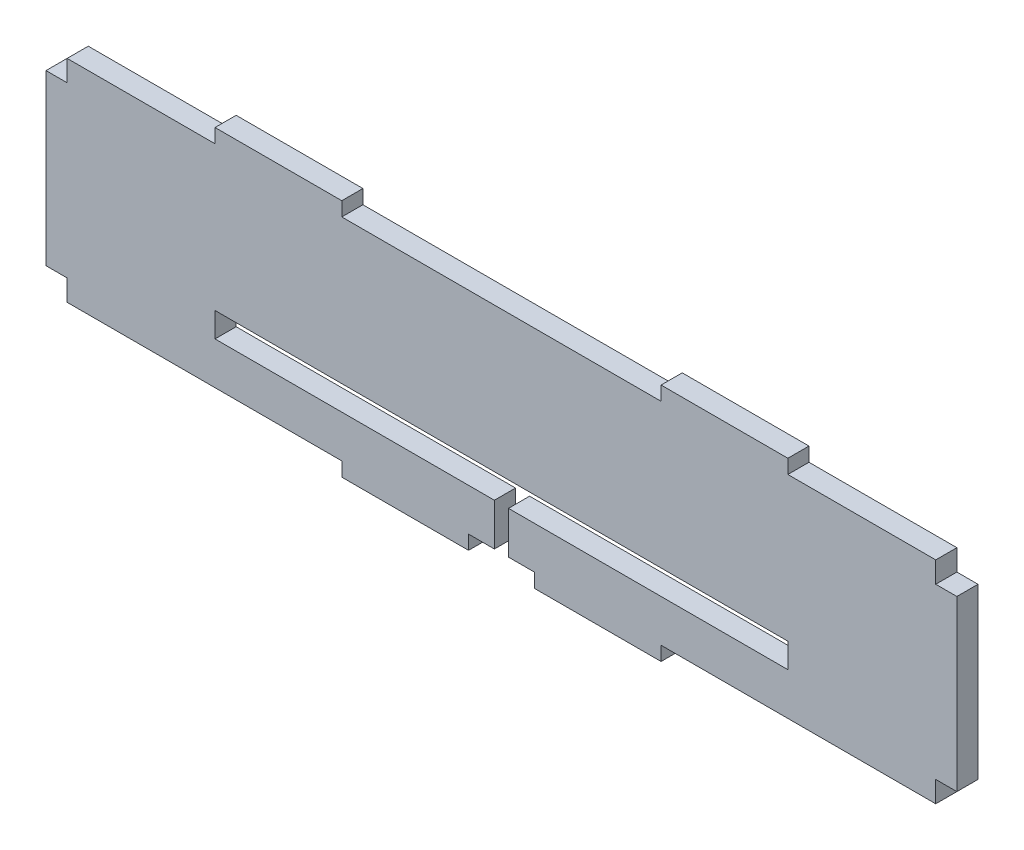
ISO-10303-21;
HEADER;
FILE_DESCRIPTION(('STEP AP214'),'2;1');
FILE_NAME('part.step','',(''),(''),'','','');
FILE_SCHEMA(('AUTOMOTIVE_DESIGN { 1 0 10303 214 1 1 1 1 }'));
ENDSEC;
DATA;
#1=APPLICATION_CONTEXT('core data for automotive mechanical design processes');
#2=APPLICATION_PROTOCOL_DEFINITION('international standard','automotive_design',2000,#1);
#3=PRODUCT_CONTEXT('',#1,'mechanical');
#4=PRODUCT('Part','Part','',(#3));
#5=PRODUCT_RELATED_PRODUCT_CATEGORY('part','',(#4));
#6=PRODUCT_DEFINITION_FORMATION('','',#4);
#7=PRODUCT_DEFINITION_CONTEXT('part definition',#1,'design');
#8=PRODUCT_DEFINITION('design','',#6,#7);
#9=PRODUCT_DEFINITION_SHAPE('','',#8);
#10=(LENGTH_UNIT() NAMED_UNIT(*) SI_UNIT(.MILLI.,.METRE.));
#11=(NAMED_UNIT(*) PLANE_ANGLE_UNIT() SI_UNIT($,.RADIAN.));
#12=(NAMED_UNIT(*) SI_UNIT($,.STERADIAN.) SOLID_ANGLE_UNIT());
#13=UNCERTAINTY_MEASURE_WITH_UNIT(LENGTH_MEASURE(1.E-05),#10,'distance_accuracy_value','');
#14=(GEOMETRIC_REPRESENTATION_CONTEXT(3) GLOBAL_UNCERTAINTY_ASSIGNED_CONTEXT((#13)) GLOBAL_UNIT_ASSIGNED_CONTEXT((#10,
#11,#12)) REPRESENTATION_CONTEXT('',''));
#15=CARTESIAN_POINT('',(0.,0.,0.));
#16=DIRECTION('',(0.,0.,1.));
#17=DIRECTION('',(1.,0.,0.));
#18=AXIS2_PLACEMENT_3D('',#15,#16,#17);
#19=CARTESIAN_POINT('',(0.,30.,3.));
#20=DIRECTION('',(0.,1.,0.));
#21=DIRECTION('',(0.,0.,1.));
#22=AXIS2_PLACEMENT_3D('',#19,#20,#21);
#23=PLANE('',#22);
#24=DIRECTION('',(1.,0.,0.));
#25=VECTOR('',#24,1.);
#26=CARTESIAN_POINT('',(0.,30.,0.));
#27=LINE('',#26,#25);
#28=CARTESIAN_POINT('',(3.,30.,0.));
#29=VERTEX_POINT('',#28);
#30=CARTESIAN_POINT('',(24.,30.,0.));
#31=VERTEX_POINT('',#30);
#32=EDGE_CURVE('E299',#29,#31,#27,.T.);
#33=ORIENTED_EDGE('',*,*,#32,.F.);
#34=DIRECTION('',(0.,0.,-1.));
#35=VECTOR('',#34,1.);
#36=CARTESIAN_POINT('',(3.,30.,3.));
#37=LINE('',#36,#35);
#38=CARTESIAN_POINT('',(3.,30.,3.));
#39=VERTEX_POINT('',#38);
#40=EDGE_CURVE('E11',#39,#29,#37,.T.);
#41=ORIENTED_EDGE('',*,*,#40,.F.);
#42=DIRECTION('',(1.,0.,0.));
#43=VECTOR('',#42,1.);
#44=CARTESIAN_POINT('',(0.,30.,3.));
#45=LINE('',#44,#43);
#46=CARTESIAN_POINT('',(24.,30.,3.));
#47=VERTEX_POINT('',#46);
#48=EDGE_CURVE('E389',#39,#47,#45,.T.);
#49=ORIENTED_EDGE('',*,*,#48,.T.);
#50=DIRECTION('',(0.,0.,-1.));
#51=VECTOR('',#50,1.);
#52=CARTESIAN_POINT('',(24.,30.,3.));
#53=LINE('',#52,#51);
#54=EDGE_CURVE('E53',#47,#31,#53,.T.);
#55=ORIENTED_EDGE('',*,*,#54,.T.);
#56=EDGE_LOOP('',(#33,#41,#49,#55));
#57=FACE_BOUND('',#56,.T.);
#58=ADVANCED_FACE('F37',(#57),#23,.T.);
#59=CARTESIAN_POINT('',(3.,0.,3.));
#60=DIRECTION('',(1.,0.,0.));
#61=DIRECTION('',(0.,0.,-1.));
#62=AXIS2_PLACEMENT_3D('',#59,#60,#61);
#63=PLANE('',#62);
#64=DIRECTION('',(0.,-1.,0.));
#65=VECTOR('',#64,1.);
#66=CARTESIAN_POINT('',(3.,0.,0.));
#67=LINE('',#66,#65);
#68=CARTESIAN_POINT('',(3.,27.,0.));
#69=VERTEX_POINT('',#68);
#70=EDGE_CURVE('E301',#29,#69,#67,.T.);
#71=ORIENTED_EDGE('',*,*,#70,.T.);
#72=DIRECTION('',(0.,0.,-1.));
#73=VECTOR('',#72,1.);
#74=CARTESIAN_POINT('',(3.,27.,3.));
#75=LINE('',#74,#73);
#76=CARTESIAN_POINT('',(3.,27.,3.));
#77=VERTEX_POINT('',#76);
#78=EDGE_CURVE('E45',#77,#69,#75,.T.);
#79=ORIENTED_EDGE('',*,*,#78,.F.);
#80=DIRECTION('',(0.,-1.,0.));
#81=VECTOR('',#80,1.);
#82=CARTESIAN_POINT('',(3.,0.,3.));
#83=LINE('',#82,#81);
#84=EDGE_CURVE('E485',#39,#77,#83,.T.);
#85=ORIENTED_EDGE('',*,*,#84,.F.);
#86=ORIENTED_EDGE('',*,*,#40,.T.);
#87=EDGE_LOOP('',(#71,#79,#85,#86));
#88=FACE_BOUND('',#87,.T.);
#89=ADVANCED_FACE('F474',(#88),#63,.F.);
#90=CARTESIAN_POINT('',(0.,27.,3.));
#91=DIRECTION('',(0.,1.,0.));
#92=DIRECTION('',(0.,0.,1.));
#93=AXIS2_PLACEMENT_3D('',#90,#91,#92);
#94=PLANE('',#93);
#95=DIRECTION('',(1.,0.,0.));
#96=VECTOR('',#95,1.);
#97=CARTESIAN_POINT('',(0.,27.,0.));
#98=LINE('',#97,#96);
#99=CARTESIAN_POINT('',(0.,27.,0.));
#100=VERTEX_POINT('',#99);
#101=EDGE_CURVE('E304',#100,#69,#98,.T.);
#102=ORIENTED_EDGE('',*,*,#101,.F.);
#103=DIRECTION('',(0.,0.,-1.));
#104=VECTOR('',#103,1.);
#105=CARTESIAN_POINT('',(0.,27.,3.));
#106=LINE('',#105,#104);
#107=CARTESIAN_POINT('',(0.,27.,3.));
#108=VERTEX_POINT('',#107);
#109=EDGE_CURVE('E464',#108,#100,#106,.T.);
#110=ORIENTED_EDGE('',*,*,#109,.F.);
#111=DIRECTION('',(1.,0.,0.));
#112=VECTOR('',#111,1.);
#113=CARTESIAN_POINT('',(0.,27.,3.));
#114=LINE('',#113,#112);
#115=EDGE_CURVE('E471',#108,#77,#114,.T.);
#116=ORIENTED_EDGE('',*,*,#115,.T.);
#117=ORIENTED_EDGE('',*,*,#78,.T.);
#118=EDGE_LOOP('',(#102,#110,#116,#117));
#119=FACE_BOUND('',#118,.T.);
#120=ADVANCED_FACE('F469',(#119),#94,.T.);
#121=CARTESIAN_POINT('',(0.,0.,3.));
#122=DIRECTION('',(-1.,0.,0.));
#123=DIRECTION('',(0.,0.,1.));
#124=AXIS2_PLACEMENT_3D('',#121,#122,#123);
#125=PLANE('',#124);
#126=DIRECTION('',(0.,1.,0.));
#127=VECTOR('',#126,1.);
#128=CARTESIAN_POINT('',(0.,0.,0.));
#129=LINE('',#128,#127);
#130=CARTESIAN_POINT('',(0.,3.,0.));
#131=VERTEX_POINT('',#130);
#132=EDGE_CURVE('E307',#131,#100,#129,.T.);
#133=ORIENTED_EDGE('',*,*,#132,.F.);
#134=DIRECTION('',(0.,0.,-1.));
#135=VECTOR('',#134,1.);
#136=CARTESIAN_POINT('',(0.,3.,3.));
#137=LINE('',#136,#135);
#138=CARTESIAN_POINT('',(0.,3.,3.));
#139=VERTEX_POINT('',#138);
#140=EDGE_CURVE('E462',#139,#131,#137,.T.);
#141=ORIENTED_EDGE('',*,*,#140,.F.);
#142=DIRECTION('',(0.,1.,0.));
#143=VECTOR('',#142,1.);
#144=CARTESIAN_POINT('',(0.,0.,3.));
#145=LINE('',#144,#143);
#146=EDGE_CURVE('E484',#139,#108,#145,.T.);
#147=ORIENTED_EDGE('',*,*,#146,.T.);
#148=ORIENTED_EDGE('',*,*,#109,.T.);
#149=EDGE_LOOP('',(#133,#141,#147,#148));
#150=FACE_BOUND('',#149,.T.);
#151=ADVANCED_FACE('F480',(#150),#125,.T.);
#152=CARTESIAN_POINT('',(0.,3.,3.));
#153=DIRECTION('',(0.,1.,0.));
#154=DIRECTION('',(0.,0.,1.));
#155=AXIS2_PLACEMENT_3D('',#152,#153,#154);
#156=PLANE('',#155);
#157=DIRECTION('',(1.,0.,0.));
#158=VECTOR('',#157,1.);
#159=CARTESIAN_POINT('',(0.,3.,0.));
#160=LINE('',#159,#158);
#161=CARTESIAN_POINT('',(3.,3.,0.));
#162=VERTEX_POINT('',#161);
#163=EDGE_CURVE('E310',#131,#162,#160,.T.);
#164=ORIENTED_EDGE('',*,*,#163,.T.);
#165=DIRECTION('',(0.,0.,-1.));
#166=VECTOR('',#165,1.);
#167=CARTESIAN_POINT('',(3.,3.,3.));
#168=LINE('',#167,#166);
#169=CARTESIAN_POINT('',(3.,3.,3.));
#170=VERTEX_POINT('',#169);
#171=EDGE_CURVE('E460',#170,#162,#168,.T.);
#172=ORIENTED_EDGE('',*,*,#171,.F.);
#173=DIRECTION('',(1.,0.,0.));
#174=VECTOR('',#173,1.);
#175=CARTESIAN_POINT('',(0.,3.,3.));
#176=LINE('',#175,#174);
#177=EDGE_CURVE('E487',#139,#170,#176,.T.);
#178=ORIENTED_EDGE('',*,*,#177,.F.);
#179=ORIENTED_EDGE('',*,*,#140,.T.);
#180=EDGE_LOOP('',(#164,#172,#178,#179));
#181=FACE_BOUND('',#180,.T.);
#182=ADVANCED_FACE('F579',(#181),#156,.F.);
#183=CARTESIAN_POINT('',(3.,0.,3.));
#184=DIRECTION('',(-1.,0.,0.));
#185=DIRECTION('',(0.,0.,1.));
#186=AXIS2_PLACEMENT_3D('',#183,#184,#185);
#187=PLANE('',#186);
#188=DIRECTION('',(0.,1.,0.));
#189=VECTOR('',#188,1.);
#190=CARTESIAN_POINT('',(3.,0.,0.));
#191=LINE('',#190,#189);
#192=CARTESIAN_POINT('',(3.,0.,0.));
#193=VERTEX_POINT('',#192);
#194=EDGE_CURVE('E313',#193,#162,#191,.T.);
#195=ORIENTED_EDGE('',*,*,#194,.F.);
#196=DIRECTION('',(0.,0.,-1.));
#197=VECTOR('',#196,1.);
#198=CARTESIAN_POINT('',(3.,0.,3.));
#199=LINE('',#198,#197);
#200=CARTESIAN_POINT('',(3.,0.,3.));
#201=VERTEX_POINT('',#200);
#202=EDGE_CURVE('E458',#201,#193,#199,.T.);
#203=ORIENTED_EDGE('',*,*,#202,.F.);
#204=DIRECTION('',(0.,1.,0.));
#205=VECTOR('',#204,1.);
#206=CARTESIAN_POINT('',(3.,0.,3.));
#207=LINE('',#206,#205);
#208=EDGE_CURVE('E493',#201,#170,#207,.T.);
#209=ORIENTED_EDGE('',*,*,#208,.T.);
#210=ORIENTED_EDGE('',*,*,#171,.T.);
#211=EDGE_LOOP('',(#195,#203,#209,#210));
#212=FACE_BOUND('',#211,.T.);
#213=ADVANCED_FACE('F582',(#212),#187,.T.);
#214=CARTESIAN_POINT('',(0.,0.,3.));
#215=DIRECTION('',(0.,1.,0.));
#216=DIRECTION('',(0.,0.,1.));
#217=AXIS2_PLACEMENT_3D('',#214,#215,#216);
#218=PLANE('',#217);
#219=DIRECTION('',(1.,0.,0.));
#220=VECTOR('',#219,1.);
#221=CARTESIAN_POINT('',(0.,0.,0.));
#222=LINE('',#221,#220);
#223=CARTESIAN_POINT('',(42.,0.,0.));
#224=VERTEX_POINT('',#223);
#225=EDGE_CURVE('E316',#193,#224,#222,.T.);
#226=ORIENTED_EDGE('',*,*,#225,.T.);
#227=DIRECTION('',(0.,0.,-1.));
#228=VECTOR('',#227,1.);
#229=CARTESIAN_POINT('',(42.,0.,3.));
#230=LINE('',#229,#228);
#231=CARTESIAN_POINT('',(42.,0.,3.));
#232=VERTEX_POINT('',#231);
#233=EDGE_CURVE('E455',#232,#224,#230,.T.);
#234=ORIENTED_EDGE('',*,*,#233,.F.);
#235=DIRECTION('',(1.,0.,0.));
#236=VECTOR('',#235,1.);
#237=CARTESIAN_POINT('',(0.,0.,3.));
#238=LINE('',#237,#236);
#239=EDGE_CURVE('E496',#201,#232,#238,.T.);
#240=ORIENTED_EDGE('',*,*,#239,.F.);
#241=ORIENTED_EDGE('',*,*,#202,.T.);
#242=EDGE_LOOP('',(#226,#234,#240,#241));
#243=FACE_BOUND('',#242,.T.);
#244=ADVANCED_FACE('F586',(#243),#218,.F.);
#245=CARTESIAN_POINT('',(42.,2.91433543964104E-13,3.));
#246=DIRECTION('',(1.,0.,0.));
#247=DIRECTION('',(0.,1.,0.));
#248=AXIS2_PLACEMENT_3D('',#245,#246,#247);
#249=PLANE('',#248);
#250=DIRECTION('',(0.,-1.,0.));
#251=VECTOR('',#250,1.);
#252=CARTESIAN_POINT('',(42.,2.91433543964104E-13,0.));
#253=LINE('',#252,#251);
#254=CARTESIAN_POINT('',(42.,-2.,0.));
#255=VERTEX_POINT('',#254);
#256=EDGE_CURVE('E318',#224,#255,#253,.T.);
#257=ORIENTED_EDGE('',*,*,#256,.T.);
#258=DIRECTION('',(0.,0.,-1.));
#259=VECTOR('',#258,1.);
#260=CARTESIAN_POINT('',(42.,-2.,3.));
#261=LINE('',#260,#259);
#262=CARTESIAN_POINT('',(42.,-2.,3.));
#263=VERTEX_POINT('',#262);
#264=EDGE_CURVE('E452',#263,#255,#261,.T.);
#265=ORIENTED_EDGE('',*,*,#264,.F.);
#266=DIRECTION('',(0.,-1.,0.));
#267=VECTOR('',#266,1.);
#268=CARTESIAN_POINT('',(42.,2.91433543964104E-13,3.));
#269=LINE('',#268,#267);
#270=EDGE_CURVE('E498',#232,#263,#269,.T.);
#271=ORIENTED_EDGE('',*,*,#270,.F.);
#272=ORIENTED_EDGE('',*,*,#233,.T.);
#273=EDGE_LOOP('',(#257,#265,#271,#272));
#274=FACE_BOUND('',#273,.T.);
#275=ADVANCED_FACE('F590',(#274),#249,.F.);
#276=CARTESIAN_POINT('',(0.,-2.,3.));
#277=DIRECTION('',(0.,1.,0.));
#278=DIRECTION('',(-1.,0.,0.));
#279=AXIS2_PLACEMENT_3D('',#276,#277,#278);
#280=PLANE('',#279);
#281=DIRECTION('',(1.,0.,0.));
#282=VECTOR('',#281,1.);
#283=CARTESIAN_POINT('',(0.,-2.,0.));
#284=LINE('',#283,#282);
#285=CARTESIAN_POINT('',(60.,-2.,0.));
#286=VERTEX_POINT('',#285);
#287=EDGE_CURVE('E320',#255,#286,#284,.T.);
#288=ORIENTED_EDGE('',*,*,#287,.T.);
#289=DIRECTION('',(0.,0.,-1.));
#290=VECTOR('',#289,1.);
#291=CARTESIAN_POINT('',(60.,-2.,3.));
#292=LINE('',#291,#290);
#293=CARTESIAN_POINT('',(60.,-2.,3.));
#294=VERTEX_POINT('',#293);
#295=EDGE_CURVE('E449',#294,#286,#292,.T.);
#296=ORIENTED_EDGE('',*,*,#295,.F.);
#297=DIRECTION('',(1.,0.,0.));
#298=VECTOR('',#297,1.);
#299=CARTESIAN_POINT('',(0.,-2.,3.));
#300=LINE('',#299,#298);
#301=EDGE_CURVE('E500',#263,#294,#300,.T.);
#302=ORIENTED_EDGE('',*,*,#301,.F.);
#303=ORIENTED_EDGE('',*,*,#264,.T.);
#304=EDGE_LOOP('',(#288,#296,#302,#303));
#305=FACE_BOUND('',#304,.T.);
#306=ADVANCED_FACE('F594',(#305),#280,.F.);
#307=CARTESIAN_POINT('',(60.,4.16333634234434E-13,3.));
#308=DIRECTION('',(-1.,0.,0.));
#309=DIRECTION('',(0.,-1.,0.));
#310=AXIS2_PLACEMENT_3D('',#307,#308,#309);
#311=PLANE('',#310);
#312=DIRECTION('',(0.,1.,0.));
#313=VECTOR('',#312,1.);
#314=CARTESIAN_POINT('',(60.,4.16333634234434E-13,0.));
#315=LINE('',#314,#313);
#316=CARTESIAN_POINT('',(60.,0.,0.));
#317=VERTEX_POINT('',#316);
#318=EDGE_CURVE('E322',#286,#317,#315,.T.);
#319=ORIENTED_EDGE('',*,*,#318,.T.);
#320=DIRECTION('',(0.,0.,-1.));
#321=VECTOR('',#320,1.);
#322=CARTESIAN_POINT('',(60.,0.,3.));
#323=LINE('',#322,#321);
#324=CARTESIAN_POINT('',(60.,0.,3.));
#325=VERTEX_POINT('',#324);
#326=EDGE_CURVE('E446',#325,#317,#323,.T.);
#327=ORIENTED_EDGE('',*,*,#326,.F.);
#328=DIRECTION('',(0.,1.,0.));
#329=VECTOR('',#328,1.);
#330=CARTESIAN_POINT('',(60.,4.16333634234434E-13,3.));
#331=LINE('',#330,#329);
#332=EDGE_CURVE('E502',#294,#325,#331,.T.);
#333=ORIENTED_EDGE('',*,*,#332,.F.);
#334=ORIENTED_EDGE('',*,*,#295,.T.);
#335=EDGE_LOOP('',(#319,#327,#333,#334));
#336=FACE_BOUND('',#335,.T.);
#337=ADVANCED_FACE('F598',(#336),#311,.F.);
#338=CARTESIAN_POINT('',(0.,0.,3.));
#339=DIRECTION('',(0.,1.,0.));
#340=DIRECTION('',(0.,0.,1.));
#341=AXIS2_PLACEMENT_3D('',#338,#339,#340);
#342=PLANE('',#341);
#343=DIRECTION('',(1.,0.,0.));
#344=VECTOR('',#343,1.);
#345=CARTESIAN_POINT('',(0.,0.,0.));
#346=LINE('',#345,#344);
#347=CARTESIAN_POINT('',(63.67,0.,0.));
#348=VERTEX_POINT('',#347);
#349=EDGE_CURVE('E324',#317,#348,#346,.T.);
#350=ORIENTED_EDGE('',*,*,#349,.T.);
#351=DIRECTION('',(0.,0.,-1.));
#352=VECTOR('',#351,1.);
#353=CARTESIAN_POINT('',(63.67,0.,3.));
#354=LINE('',#353,#352);
#355=CARTESIAN_POINT('',(63.67,0.,3.));
#356=VERTEX_POINT('',#355);
#357=EDGE_CURVE('E443',#356,#348,#354,.T.);
#358=ORIENTED_EDGE('',*,*,#357,.F.);
#359=DIRECTION('',(1.,0.,0.));
#360=VECTOR('',#359,1.);
#361=CARTESIAN_POINT('',(0.,0.,3.));
#362=LINE('',#361,#360);
#363=EDGE_CURVE('E504',#325,#356,#362,.T.);
#364=ORIENTED_EDGE('',*,*,#363,.F.);
#365=ORIENTED_EDGE('',*,*,#326,.T.);
#366=EDGE_LOOP('',(#350,#358,#364,#365));
#367=FACE_BOUND('',#366,.T.);
#368=ADVANCED_FACE('F602',(#367),#342,.F.);
#369=CARTESIAN_POINT('',(63.67,0.,3.));
#370=DIRECTION('',(-1.,0.,0.));
#371=DIRECTION('',(0.,0.,1.));
#372=AXIS2_PLACEMENT_3D('',#369,#370,#371);
#373=PLANE('',#372);
#374=DIRECTION('',(0.,1.,0.));
#375=VECTOR('',#374,1.);
#376=CARTESIAN_POINT('',(63.67,0.,0.));
#377=LINE('',#376,#375);
#378=CARTESIAN_POINT('',(63.67,6.,0.));
#379=VERTEX_POINT('',#378);
#380=EDGE_CURVE('E326',#348,#379,#377,.T.);
#381=ORIENTED_EDGE('',*,*,#380,.T.);
#382=DIRECTION('',(0.,0.,-1.));
#383=VECTOR('',#382,1.);
#384=CARTESIAN_POINT('',(63.67,6.,3.));
#385=LINE('',#384,#383);
#386=CARTESIAN_POINT('',(63.67,6.,3.));
#387=VERTEX_POINT('',#386);
#388=EDGE_CURVE('E441',#387,#379,#385,.T.);
#389=ORIENTED_EDGE('',*,*,#388,.F.);
#390=DIRECTION('',(0.,1.,0.));
#391=VECTOR('',#390,1.);
#392=CARTESIAN_POINT('',(63.67,0.,3.));
#393=LINE('',#392,#391);
#394=EDGE_CURVE('E506',#356,#387,#393,.T.);
#395=ORIENTED_EDGE('',*,*,#394,.F.);
#396=ORIENTED_EDGE('',*,*,#357,.T.);
#397=EDGE_LOOP('',(#381,#389,#395,#396));
#398=FACE_BOUND('',#397,.T.);
#399=ADVANCED_FACE('F604',(#398),#373,.F.);
#400=CARTESIAN_POINT('',(0.,6.,3.));
#401=DIRECTION('',(0.,1.,0.));
#402=DIRECTION('',(0.,0.,1.));
#403=AXIS2_PLACEMENT_3D('',#400,#401,#402);
#404=PLANE('',#403);
#405=DIRECTION('',(1.,0.,0.));
#406=VECTOR('',#405,1.);
#407=CARTESIAN_POINT('',(0.,6.,0.));
#408=LINE('',#407,#406);
#409=CARTESIAN_POINT('',(24.,6.,0.));
#410=VERTEX_POINT('',#409);
#411=EDGE_CURVE('E330',#410,#379,#408,.T.);
#412=ORIENTED_EDGE('',*,*,#411,.F.);
#413=DIRECTION('',(0.,0.,-1.));
#414=VECTOR('',#413,1.);
#415=CARTESIAN_POINT('',(24.,6.,3.));
#416=LINE('',#415,#414);
#417=CARTESIAN_POINT('',(24.,6.,3.));
#418=VERTEX_POINT('',#417);
#419=EDGE_CURVE('E439',#418,#410,#416,.T.);
#420=ORIENTED_EDGE('',*,*,#419,.F.);
#421=DIRECTION('',(1.,0.,0.));
#422=VECTOR('',#421,1.);
#423=CARTESIAN_POINT('',(0.,6.,3.));
#424=LINE('',#423,#422);
#425=EDGE_CURVE('E509',#418,#387,#424,.T.);
#426=ORIENTED_EDGE('',*,*,#425,.T.);
#427=ORIENTED_EDGE('',*,*,#388,.T.);
#428=EDGE_LOOP('',(#412,#420,#426,#427));
#429=FACE_BOUND('',#428,.T.);
#430=ADVANCED_FACE('F607',(#429),#404,.T.);
#431=CARTESIAN_POINT('',(24.,0.,3.));
#432=DIRECTION('',(1.,0.,0.));
#433=DIRECTION('',(0.,0.,-1.));
#434=AXIS2_PLACEMENT_3D('',#431,#432,#433);
#435=PLANE('',#434);
#436=DIRECTION('',(0.,-1.,0.));
#437=VECTOR('',#436,1.);
#438=CARTESIAN_POINT('',(24.,0.,0.));
#439=LINE('',#438,#437);
#440=CARTESIAN_POINT('',(24.,9.5,0.));
#441=VERTEX_POINT('',#440);
#442=EDGE_CURVE('E333',#441,#410,#439,.T.);
#443=ORIENTED_EDGE('',*,*,#442,.F.);
#444=DIRECTION('',(0.,0.,-1.));
#445=VECTOR('',#444,1.);
#446=CARTESIAN_POINT('',(24.,9.5,3.));
#447=LINE('',#446,#445);
#448=CARTESIAN_POINT('',(24.,9.5,3.));
#449=VERTEX_POINT('',#448);
#450=EDGE_CURVE('E437',#449,#441,#447,.T.);
#451=ORIENTED_EDGE('',*,*,#450,.F.);
#452=DIRECTION('',(0.,-1.,0.));
#453=VECTOR('',#452,1.);
#454=CARTESIAN_POINT('',(24.,0.,3.));
#455=LINE('',#454,#453);
#456=EDGE_CURVE('E512',#449,#418,#455,.T.);
#457=ORIENTED_EDGE('',*,*,#456,.T.);
#458=ORIENTED_EDGE('',*,*,#419,.T.);
#459=EDGE_LOOP('',(#443,#451,#457,#458));
#460=FACE_BOUND('',#459,.T.);
#461=ADVANCED_FACE('F611',(#460),#435,.T.);
#462=CARTESIAN_POINT('',(0.,9.5,3.));
#463=DIRECTION('',(0.,1.,0.));
#464=DIRECTION('',(0.,0.,1.));
#465=AXIS2_PLACEMENT_3D('',#462,#463,#464);
#466=PLANE('',#465);
#467=DIRECTION('',(1.,0.,0.));
#468=VECTOR('',#467,1.);
#469=CARTESIAN_POINT('',(0.,9.5,0.));
#470=LINE('',#469,#468);
#471=CARTESIAN_POINT('',(105.34,9.5,0.));
#472=VERTEX_POINT('',#471);
#473=EDGE_CURVE('E336',#441,#472,#470,.T.);
#474=ORIENTED_EDGE('',*,*,#473,.T.);
#475=DIRECTION('',(0.,0.,-1.));
#476=VECTOR('',#475,1.);
#477=CARTESIAN_POINT('',(105.34,9.5,3.));
#478=LINE('',#477,#476);
#479=CARTESIAN_POINT('',(105.34,9.5,3.));
#480=VERTEX_POINT('',#479);
#481=EDGE_CURVE('E434',#480,#472,#478,.T.);
#482=ORIENTED_EDGE('',*,*,#481,.F.);
#483=DIRECTION('',(1.,0.,0.));
#484=VECTOR('',#483,1.);
#485=CARTESIAN_POINT('',(0.,9.5,3.));
#486=LINE('',#485,#484);
#487=EDGE_CURVE('E515',#449,#480,#486,.T.);
#488=ORIENTED_EDGE('',*,*,#487,.F.);
#489=ORIENTED_EDGE('',*,*,#450,.T.);
#490=EDGE_LOOP('',(#474,#482,#488,#489));
#491=FACE_BOUND('',#490,.T.);
#492=ADVANCED_FACE('F615',(#491),#466,.F.);
#493=CARTESIAN_POINT('',(105.34,0.,3.));
#494=DIRECTION('',(1.,0.,0.));
#495=DIRECTION('',(0.,0.,-1.));
#496=AXIS2_PLACEMENT_3D('',#493,#494,#495);
#497=PLANE('',#496);
#498=DIRECTION('',(0.,-1.,0.));
#499=VECTOR('',#498,1.);
#500=CARTESIAN_POINT('',(105.34,0.,0.));
#501=LINE('',#500,#499);
#502=CARTESIAN_POINT('',(105.34,6.,0.));
#503=VERTEX_POINT('',#502);
#504=EDGE_CURVE('E338',#472,#503,#501,.T.);
#505=ORIENTED_EDGE('',*,*,#504,.T.);
#506=DIRECTION('',(0.,0.,-1.));
#507=VECTOR('',#506,1.);
#508=CARTESIAN_POINT('',(105.34,6.,3.));
#509=LINE('',#508,#507);
#510=CARTESIAN_POINT('',(105.34,6.,3.));
#511=VERTEX_POINT('',#510);
#512=EDGE_CURVE('E432',#511,#503,#509,.T.);
#513=ORIENTED_EDGE('',*,*,#512,.F.);
#514=DIRECTION('',(0.,-1.,0.));
#515=VECTOR('',#514,1.);
#516=CARTESIAN_POINT('',(105.34,0.,3.));
#517=LINE('',#516,#515);
#518=EDGE_CURVE('E517',#480,#511,#517,.T.);
#519=ORIENTED_EDGE('',*,*,#518,.F.);
#520=ORIENTED_EDGE('',*,*,#481,.T.);
#521=EDGE_LOOP('',(#505,#513,#519,#520));
#522=FACE_BOUND('',#521,.T.);
#523=ADVANCED_FACE('F619',(#522),#497,.F.);
#524=CARTESIAN_POINT('',(0.,6.,3.));
#525=DIRECTION('',(0.,1.,0.));
#526=DIRECTION('',(0.,0.,1.));
#527=AXIS2_PLACEMENT_3D('',#524,#525,#526);
#528=PLANE('',#527);
#529=DIRECTION('',(1.,0.,0.));
#530=VECTOR('',#529,1.);
#531=CARTESIAN_POINT('',(0.,6.,0.));
#532=LINE('',#531,#530);
#533=CARTESIAN_POINT('',(65.67,6.,0.));
#534=VERTEX_POINT('',#533);
#535=EDGE_CURVE('E341',#534,#503,#532,.T.);
#536=ORIENTED_EDGE('',*,*,#535,.F.);
#537=DIRECTION('',(0.,0.,-1.));
#538=VECTOR('',#537,1.);
#539=CARTESIAN_POINT('',(65.67,6.,3.));
#540=LINE('',#539,#538);
#541=CARTESIAN_POINT('',(65.67,6.,3.));
#542=VERTEX_POINT('',#541);
#543=EDGE_CURVE('E430',#542,#534,#540,.T.);
#544=ORIENTED_EDGE('',*,*,#543,.F.);
#545=DIRECTION('',(1.,0.,0.));
#546=VECTOR('',#545,1.);
#547=CARTESIAN_POINT('',(0.,6.,3.));
#548=LINE('',#547,#546);
#549=EDGE_CURVE('E519',#542,#511,#548,.T.);
#550=ORIENTED_EDGE('',*,*,#549,.T.);
#551=ORIENTED_EDGE('',*,*,#512,.T.);
#552=EDGE_LOOP('',(#536,#544,#550,#551));
#553=FACE_BOUND('',#552,.T.);
#554=ADVANCED_FACE('F623',(#553),#528,.T.);
#555=CARTESIAN_POINT('',(65.67,0.,3.));
#556=DIRECTION('',(-1.,0.,0.));
#557=DIRECTION('',(0.,0.,1.));
#558=AXIS2_PLACEMENT_3D('',#555,#556,#557);
#559=PLANE('',#558);
#560=DIRECTION('',(0.,1.,0.));
#561=VECTOR('',#560,1.);
#562=CARTESIAN_POINT('',(65.67,0.,0.));
#563=LINE('',#562,#561);
#564=CARTESIAN_POINT('',(65.67,0.,0.));
#565=VERTEX_POINT('',#564);
#566=EDGE_CURVE('E344',#565,#534,#563,.T.);
#567=ORIENTED_EDGE('',*,*,#566,.F.);
#568=DIRECTION('',(0.,0.,-1.));
#569=VECTOR('',#568,1.);
#570=CARTESIAN_POINT('',(65.67,0.,3.));
#571=LINE('',#570,#569);
#572=CARTESIAN_POINT('',(65.67,0.,3.));
#573=VERTEX_POINT('',#572);
#574=EDGE_CURVE('E428',#573,#565,#571,.T.);
#575=ORIENTED_EDGE('',*,*,#574,.F.);
#576=DIRECTION('',(0.,1.,0.));
#577=VECTOR('',#576,1.);
#578=CARTESIAN_POINT('',(65.67,0.,3.));
#579=LINE('',#578,#577);
#580=EDGE_CURVE('E522',#573,#542,#579,.T.);
#581=ORIENTED_EDGE('',*,*,#580,.T.);
#582=ORIENTED_EDGE('',*,*,#543,.T.);
#583=EDGE_LOOP('',(#567,#575,#581,#582));
#584=FACE_BOUND('',#583,.T.);
#585=ADVANCED_FACE('F627',(#584),#559,.T.);
#586=CARTESIAN_POINT('',(69.34,0.,0.));
#587=VERTEX_POINT('',#586);
#588=EDGE_CURVE('E327',#565,#587,#346,.T.);
#589=ORIENTED_EDGE('',*,*,#588,.T.);
#590=DIRECTION('',(0.,0.,-1.));
#591=VECTOR('',#590,1.);
#592=CARTESIAN_POINT('',(69.34,0.,3.));
#593=LINE('',#592,#591);
#594=CARTESIAN_POINT('',(69.34,0.,3.));
#595=VERTEX_POINT('',#594);
#596=EDGE_CURVE('E425',#595,#587,#593,.T.);
#597=ORIENTED_EDGE('',*,*,#596,.F.);
#598=EDGE_CURVE('E507',#573,#595,#362,.T.);
#599=ORIENTED_EDGE('',*,*,#598,.F.);
#600=ORIENTED_EDGE('',*,*,#574,.T.);
#601=EDGE_LOOP('',(#589,#597,#599,#600));
#602=FACE_BOUND('',#601,.T.);
#603=ADVANCED_FACE('F631',(#602),#342,.F.);
#604=CARTESIAN_POINT('',(69.34,0.,3.));
#605=DIRECTION('',(1.,0.,0.));
#606=DIRECTION('',(0.,0.,-1.));
#607=AXIS2_PLACEMENT_3D('',#604,#605,#606);
#608=PLANE('',#607);
#609=DIRECTION('',(0.,-1.,0.));
#610=VECTOR('',#609,1.);
#611=CARTESIAN_POINT('',(69.34,0.,0.));
#612=LINE('',#611,#610);
#613=CARTESIAN_POINT('',(69.34,-2.,0.));
#614=VERTEX_POINT('',#613);
#615=EDGE_CURVE('E347',#587,#614,#612,.T.);
#616=ORIENTED_EDGE('',*,*,#615,.T.);
#617=DIRECTION('',(0.,0.,-1.));
#618=VECTOR('',#617,1.);
#619=CARTESIAN_POINT('',(69.34,-2.,3.));
#620=LINE('',#619,#618);
#621=CARTESIAN_POINT('',(69.34,-2.,3.));
#622=VERTEX_POINT('',#621);
#623=EDGE_CURVE('E422',#622,#614,#620,.T.);
#624=ORIENTED_EDGE('',*,*,#623,.F.);
#625=DIRECTION('',(0.,-1.,0.));
#626=VECTOR('',#625,1.);
#627=CARTESIAN_POINT('',(69.34,0.,3.));
#628=LINE('',#627,#626);
#629=EDGE_CURVE('E525',#595,#622,#628,.T.);
#630=ORIENTED_EDGE('',*,*,#629,.F.);
#631=ORIENTED_EDGE('',*,*,#596,.T.);
#632=EDGE_LOOP('',(#616,#624,#630,#631));
#633=FACE_BOUND('',#632,.T.);
#634=ADVANCED_FACE('F635',(#633),#608,.F.);
#635=CARTESIAN_POINT('',(0.,-2.,3.));
#636=DIRECTION('',(0.,1.,0.));
#637=DIRECTION('',(0.,0.,1.));
#638=AXIS2_PLACEMENT_3D('',#635,#636,#637);
#639=PLANE('',#638);
#640=DIRECTION('',(1.,0.,0.));
#641=VECTOR('',#640,1.);
#642=CARTESIAN_POINT('',(0.,-2.,0.));
#643=LINE('',#642,#641);
#644=CARTESIAN_POINT('',(87.34,-2.,0.));
#645=VERTEX_POINT('',#644);
#646=EDGE_CURVE('E349',#614,#645,#643,.T.);
#647=ORIENTED_EDGE('',*,*,#646,.T.);
#648=DIRECTION('',(0.,0.,-1.));
#649=VECTOR('',#648,1.);
#650=CARTESIAN_POINT('',(87.34,-2.,3.));
#651=LINE('',#650,#649);
#652=CARTESIAN_POINT('',(87.34,-2.,3.));
#653=VERTEX_POINT('',#652);
#654=EDGE_CURVE('E419',#653,#645,#651,.T.);
#655=ORIENTED_EDGE('',*,*,#654,.F.);
#656=DIRECTION('',(1.,0.,0.));
#657=VECTOR('',#656,1.);
#658=CARTESIAN_POINT('',(0.,-2.,3.));
#659=LINE('',#658,#657);
#660=EDGE_CURVE('E527',#622,#653,#659,.T.);
#661=ORIENTED_EDGE('',*,*,#660,.F.);
#662=ORIENTED_EDGE('',*,*,#623,.T.);
#663=EDGE_LOOP('',(#647,#655,#661,#662));
#664=FACE_BOUND('',#663,.T.);
#665=ADVANCED_FACE('F639',(#664),#639,.F.);
#666=CARTESIAN_POINT('',(87.34,0.,3.));
#667=DIRECTION('',(-1.,0.,0.));
#668=DIRECTION('',(0.,0.,1.));
#669=AXIS2_PLACEMENT_3D('',#666,#667,#668);
#670=PLANE('',#669);
#671=DIRECTION('',(0.,1.,0.));
#672=VECTOR('',#671,1.);
#673=CARTESIAN_POINT('',(87.34,0.,0.));
#674=LINE('',#673,#672);
#675=CARTESIAN_POINT('',(87.34,0.,0.));
#676=VERTEX_POINT('',#675);
#677=EDGE_CURVE('E351',#645,#676,#674,.T.);
#678=ORIENTED_EDGE('',*,*,#677,.T.);
#679=DIRECTION('',(0.,0.,-1.));
#680=VECTOR('',#679,1.);
#681=CARTESIAN_POINT('',(87.34,0.,3.));
#682=LINE('',#681,#680);
#683=CARTESIAN_POINT('',(87.34,0.,3.));
#684=VERTEX_POINT('',#683);
#685=EDGE_CURVE('E416',#684,#676,#682,.T.);
#686=ORIENTED_EDGE('',*,*,#685,.F.);
#687=DIRECTION('',(0.,1.,0.));
#688=VECTOR('',#687,1.);
#689=CARTESIAN_POINT('',(87.34,0.,3.));
#690=LINE('',#689,#688);
#691=EDGE_CURVE('E529',#653,#684,#690,.T.);
#692=ORIENTED_EDGE('',*,*,#691,.F.);
#693=ORIENTED_EDGE('',*,*,#654,.T.);
#694=EDGE_LOOP('',(#678,#686,#692,#693));
#695=FACE_BOUND('',#694,.T.);
#696=ADVANCED_FACE('F643',(#695),#670,.F.);
#697=CARTESIAN_POINT('',(0.,0.,3.));
#698=DIRECTION('',(0.,1.,0.));
#699=DIRECTION('',(0.,0.,1.));
#700=AXIS2_PLACEMENT_3D('',#697,#698,#699);
#701=PLANE('',#700);
#702=DIRECTION('',(1.,0.,0.));
#703=VECTOR('',#702,1.);
#704=CARTESIAN_POINT('',(0.,0.,0.));
#705=LINE('',#704,#703);
#706=CARTESIAN_POINT('',(126.34,0.,0.));
#707=VERTEX_POINT('',#706);
#708=EDGE_CURVE('E353',#676,#707,#705,.T.);
#709=ORIENTED_EDGE('',*,*,#708,.T.);
#710=DIRECTION('',(0.,0.,-1.));
#711=VECTOR('',#710,1.);
#712=CARTESIAN_POINT('',(126.34,0.,3.));
#713=LINE('',#712,#711);
#714=CARTESIAN_POINT('',(126.34,0.,3.));
#715=VERTEX_POINT('',#714);
#716=EDGE_CURVE('E413',#715,#707,#713,.T.);
#717=ORIENTED_EDGE('',*,*,#716,.F.);
#718=DIRECTION('',(1.,0.,0.));
#719=VECTOR('',#718,1.);
#720=CARTESIAN_POINT('',(0.,0.,3.));
#721=LINE('',#720,#719);
#722=EDGE_CURVE('E531',#684,#715,#721,.T.);
#723=ORIENTED_EDGE('',*,*,#722,.F.);
#724=ORIENTED_EDGE('',*,*,#685,.T.);
#725=EDGE_LOOP('',(#709,#717,#723,#724));
#726=FACE_BOUND('',#725,.T.);
#727=ADVANCED_FACE('F647',(#726),#701,.F.);
#728=CARTESIAN_POINT('',(126.34,0.,3.));
#729=DIRECTION('',(-1.,0.,0.));
#730=DIRECTION('',(0.,0.,1.));
#731=AXIS2_PLACEMENT_3D('',#728,#729,#730);
#732=PLANE('',#731);
#733=DIRECTION('',(0.,1.,0.));
#734=VECTOR('',#733,1.);
#735=CARTESIAN_POINT('',(126.34,0.,0.));
#736=LINE('',#735,#734);
#737=CARTESIAN_POINT('',(126.34,3.,0.));
#738=VERTEX_POINT('',#737);
#739=EDGE_CURVE('E355',#707,#738,#736,.T.);
#740=ORIENTED_EDGE('',*,*,#739,.T.);
#741=DIRECTION('',(0.,0.,-1.));
#742=VECTOR('',#741,1.);
#743=CARTESIAN_POINT('',(126.34,3.,3.));
#744=LINE('',#743,#742);
#745=CARTESIAN_POINT('',(126.34,3.,3.));
#746=VERTEX_POINT('',#745);
#747=EDGE_CURVE('E411',#746,#738,#744,.T.);
#748=ORIENTED_EDGE('',*,*,#747,.F.);
#749=DIRECTION('',(0.,1.,0.));
#750=VECTOR('',#749,1.);
#751=CARTESIAN_POINT('',(126.34,0.,3.));
#752=LINE('',#751,#750);
#753=EDGE_CURVE('E533',#715,#746,#752,.T.);
#754=ORIENTED_EDGE('',*,*,#753,.F.);
#755=ORIENTED_EDGE('',*,*,#716,.T.);
#756=EDGE_LOOP('',(#740,#748,#754,#755));
#757=FACE_BOUND('',#756,.T.);
#758=ADVANCED_FACE('F651',(#757),#732,.F.);
#759=CARTESIAN_POINT('',(0.,3.,3.));
#760=DIRECTION('',(0.,-1.,0.));
#761=DIRECTION('',(0.,0.,-1.));
#762=AXIS2_PLACEMENT_3D('',#759,#760,#761);
#763=PLANE('',#762);
#764=DIRECTION('',(-1.,0.,0.));
#765=VECTOR('',#764,1.);
#766=CARTESIAN_POINT('',(0.,3.,0.));
#767=LINE('',#766,#765);
#768=CARTESIAN_POINT('',(129.34,3.,0.));
#769=VERTEX_POINT('',#768);
#770=EDGE_CURVE('E358',#769,#738,#767,.T.);
#771=ORIENTED_EDGE('',*,*,#770,.F.);
#772=DIRECTION('',(0.,0.,-1.));
#773=VECTOR('',#772,1.);
#774=CARTESIAN_POINT('',(129.34,3.,3.));
#775=LINE('',#774,#773);
#776=CARTESIAN_POINT('',(129.34,3.,3.));
#777=VERTEX_POINT('',#776);
#778=EDGE_CURVE('E409',#777,#769,#775,.T.);
#779=ORIENTED_EDGE('',*,*,#778,.F.);
#780=DIRECTION('',(-1.,0.,0.));
#781=VECTOR('',#780,1.);
#782=CARTESIAN_POINT('',(0.,3.,3.));
#783=LINE('',#782,#781);
#784=EDGE_CURVE('E535',#777,#746,#783,.T.);
#785=ORIENTED_EDGE('',*,*,#784,.T.);
#786=ORIENTED_EDGE('',*,*,#747,.T.);
#787=EDGE_LOOP('',(#771,#779,#785,#786));
#788=FACE_BOUND('',#787,.T.);
#789=ADVANCED_FACE('F655',(#788),#763,.T.);
#790=CARTESIAN_POINT('',(129.34,0.,3.));
#791=DIRECTION('',(-1.,0.,0.));
#792=DIRECTION('',(0.,0.,1.));
#793=AXIS2_PLACEMENT_3D('',#790,#791,#792);
#794=PLANE('',#793);
#795=DIRECTION('',(0.,1.,0.));
#796=VECTOR('',#795,1.);
#797=CARTESIAN_POINT('',(129.34,0.,0.));
#798=LINE('',#797,#796);
#799=CARTESIAN_POINT('',(129.34,27.,0.));
#800=VERTEX_POINT('',#799);
#801=EDGE_CURVE('E361',#769,#800,#798,.T.);
#802=ORIENTED_EDGE('',*,*,#801,.T.);
#803=DIRECTION('',(0.,0.,-1.));
#804=VECTOR('',#803,1.);
#805=CARTESIAN_POINT('',(129.34,27.,3.));
#806=LINE('',#805,#804);
#807=CARTESIAN_POINT('',(129.34,27.,3.));
#808=VERTEX_POINT('',#807);
#809=EDGE_CURVE('E406',#808,#800,#806,.T.);
#810=ORIENTED_EDGE('',*,*,#809,.F.);
#811=DIRECTION('',(0.,1.,0.));
#812=VECTOR('',#811,1.);
#813=CARTESIAN_POINT('',(129.34,0.,3.));
#814=LINE('',#813,#812);
#815=EDGE_CURVE('E538',#777,#808,#814,.T.);
#816=ORIENTED_EDGE('',*,*,#815,.F.);
#817=ORIENTED_EDGE('',*,*,#778,.T.);
#818=EDGE_LOOP('',(#802,#810,#816,#817));
#819=FACE_BOUND('',#818,.T.);
#820=ADVANCED_FACE('F659',(#819),#794,.F.);
#821=CARTESIAN_POINT('',(0.,27.,3.));
#822=DIRECTION('',(0.,-1.,0.));
#823=DIRECTION('',(0.,0.,-1.));
#824=AXIS2_PLACEMENT_3D('',#821,#822,#823);
#825=PLANE('',#824);
#826=DIRECTION('',(-1.,0.,0.));
#827=VECTOR('',#826,1.);
#828=CARTESIAN_POINT('',(0.,27.,0.));
#829=LINE('',#828,#827);
#830=CARTESIAN_POINT('',(126.34,27.,0.));
#831=VERTEX_POINT('',#830);
#832=EDGE_CURVE('E363',#800,#831,#829,.T.);
#833=ORIENTED_EDGE('',*,*,#832,.T.);
#834=DIRECTION('',(0.,0.,-1.));
#835=VECTOR('',#834,1.);
#836=CARTESIAN_POINT('',(126.34,27.,3.));
#837=LINE('',#836,#835);
#838=CARTESIAN_POINT('',(126.34,27.,3.));
#839=VERTEX_POINT('',#838);
#840=EDGE_CURVE('E404',#839,#831,#837,.T.);
#841=ORIENTED_EDGE('',*,*,#840,.F.);
#842=DIRECTION('',(-1.,0.,0.));
#843=VECTOR('',#842,1.);
#844=CARTESIAN_POINT('',(0.,27.,3.));
#845=LINE('',#844,#843);
#846=EDGE_CURVE('E540',#808,#839,#845,.T.);
#847=ORIENTED_EDGE('',*,*,#846,.F.);
#848=ORIENTED_EDGE('',*,*,#809,.T.);
#849=EDGE_LOOP('',(#833,#841,#847,#848));
#850=FACE_BOUND('',#849,.T.);
#851=ADVANCED_FACE('F663',(#850),#825,.F.);
#852=CARTESIAN_POINT('',(126.34,0.,3.));
#853=DIRECTION('',(1.,0.,0.));
#854=DIRECTION('',(0.,0.,-1.));
#855=AXIS2_PLACEMENT_3D('',#852,#853,#854);
#856=PLANE('',#855);
#857=DIRECTION('',(0.,-1.,0.));
#858=VECTOR('',#857,1.);
#859=CARTESIAN_POINT('',(126.34,0.,0.));
#860=LINE('',#859,#858);
#861=CARTESIAN_POINT('',(126.34,30.,0.));
#862=VERTEX_POINT('',#861);
#863=EDGE_CURVE('E366',#862,#831,#860,.T.);
#864=ORIENTED_EDGE('',*,*,#863,.F.);
#865=DIRECTION('',(0.,0.,-1.));
#866=VECTOR('',#865,1.);
#867=CARTESIAN_POINT('',(126.34,30.,3.));
#868=LINE('',#867,#866);
#869=CARTESIAN_POINT('',(126.34,30.,3.));
#870=VERTEX_POINT('',#869);
#871=EDGE_CURVE('E402',#870,#862,#868,.T.);
#872=ORIENTED_EDGE('',*,*,#871,.F.);
#873=DIRECTION('',(0.,-1.,0.));
#874=VECTOR('',#873,1.);
#875=CARTESIAN_POINT('',(126.34,0.,3.));
#876=LINE('',#875,#874);
#877=EDGE_CURVE('E542',#870,#839,#876,.T.);
#878=ORIENTED_EDGE('',*,*,#877,.T.);
#879=ORIENTED_EDGE('',*,*,#840,.T.);
#880=EDGE_LOOP('',(#864,#872,#878,#879));
#881=FACE_BOUND('',#880,.T.);
#882=ADVANCED_FACE('F667',(#881),#856,.T.);
#883=CARTESIAN_POINT('',(0.,30.,3.));
#884=DIRECTION('',(0.,-1.,0.));
#885=DIRECTION('',(0.,0.,-1.));
#886=AXIS2_PLACEMENT_3D('',#883,#884,#885);
#887=PLANE('',#886);
#888=DIRECTION('',(-1.,0.,0.));
#889=VECTOR('',#888,1.);
#890=CARTESIAN_POINT('',(0.,30.,0.));
#891=LINE('',#890,#889);
#892=CARTESIAN_POINT('',(105.34,30.,0.));
#893=VERTEX_POINT('',#892);
#894=EDGE_CURVE('E369',#862,#893,#891,.T.);
#895=ORIENTED_EDGE('',*,*,#894,.T.);
#896=DIRECTION('',(0.,0.,-1.));
#897=VECTOR('',#896,1.);
#898=CARTESIAN_POINT('',(105.34,30.,3.));
#899=LINE('',#898,#897);
#900=CARTESIAN_POINT('',(105.34,30.,3.));
#901=VERTEX_POINT('',#900);
#902=EDGE_CURVE('E399',#901,#893,#899,.T.);
#903=ORIENTED_EDGE('',*,*,#902,.F.);
#904=DIRECTION('',(-1.,0.,0.));
#905=VECTOR('',#904,1.);
#906=CARTESIAN_POINT('',(0.,30.,3.));
#907=LINE('',#906,#905);
#908=EDGE_CURVE('E545',#870,#901,#907,.T.);
#909=ORIENTED_EDGE('',*,*,#908,.F.);
#910=ORIENTED_EDGE('',*,*,#871,.T.);
#911=EDGE_LOOP('',(#895,#903,#909,#910));
#912=FACE_BOUND('',#911,.T.);
#913=ADVANCED_FACE('F671',(#912),#887,.F.);
#914=CARTESIAN_POINT('',(105.34,0.,3.));
#915=DIRECTION('',(-1.,0.,0.));
#916=DIRECTION('',(0.,0.,1.));
#917=AXIS2_PLACEMENT_3D('',#914,#915,#916);
#918=PLANE('',#917);
#919=DIRECTION('',(0.,1.,0.));
#920=VECTOR('',#919,1.);
#921=CARTESIAN_POINT('',(105.34,0.,0.));
#922=LINE('',#921,#920);
#923=CARTESIAN_POINT('',(105.34,32.,0.));
#924=VERTEX_POINT('',#923);
#925=EDGE_CURVE('E371',#893,#924,#922,.T.);
#926=ORIENTED_EDGE('',*,*,#925,.T.);
#927=DIRECTION('',(0.,0.,-1.));
#928=VECTOR('',#927,1.);
#929=CARTESIAN_POINT('',(105.34,32.,3.));
#930=LINE('',#929,#928);
#931=CARTESIAN_POINT('',(105.34,32.,3.));
#932=VERTEX_POINT('',#931);
#933=EDGE_CURVE('E397',#932,#924,#930,.T.);
#934=ORIENTED_EDGE('',*,*,#933,.F.);
#935=DIRECTION('',(0.,1.,0.));
#936=VECTOR('',#935,1.);
#937=CARTESIAN_POINT('',(105.34,0.,3.));
#938=LINE('',#937,#936);
#939=EDGE_CURVE('E547',#901,#932,#938,.T.);
#940=ORIENTED_EDGE('',*,*,#939,.F.);
#941=ORIENTED_EDGE('',*,*,#902,.T.);
#942=EDGE_LOOP('',(#926,#934,#940,#941));
#943=FACE_BOUND('',#942,.T.);
#944=ADVANCED_FACE('F675',(#943),#918,.F.);
#945=CARTESIAN_POINT('',(0.,32.,3.));
#946=DIRECTION('',(0.,1.,0.));
#947=DIRECTION('',(0.,0.,1.));
#948=AXIS2_PLACEMENT_3D('',#945,#946,#947);
#949=PLANE('',#948);
#950=DIRECTION('',(1.,0.,0.));
#951=VECTOR('',#950,1.);
#952=CARTESIAN_POINT('',(0.,32.,0.));
#953=LINE('',#952,#951);
#954=CARTESIAN_POINT('',(87.34,32.,0.));
#955=VERTEX_POINT('',#954);
#956=EDGE_CURVE('E374',#955,#924,#953,.T.);
#957=ORIENTED_EDGE('',*,*,#956,.F.);
#958=DIRECTION('',(0.,0.,-1.));
#959=VECTOR('',#958,1.);
#960=CARTESIAN_POINT('',(87.34,32.,3.));
#961=LINE('',#960,#959);
#962=CARTESIAN_POINT('',(87.34,32.,3.));
#963=VERTEX_POINT('',#962);
#964=EDGE_CURVE('E395',#963,#955,#961,.T.);
#965=ORIENTED_EDGE('',*,*,#964,.F.);
#966=DIRECTION('',(1.,0.,0.));
#967=VECTOR('',#966,1.);
#968=CARTESIAN_POINT('',(0.,32.,3.));
#969=LINE('',#968,#967);
#970=EDGE_CURVE('E549',#963,#932,#969,.T.);
#971=ORIENTED_EDGE('',*,*,#970,.T.);
#972=ORIENTED_EDGE('',*,*,#933,.T.);
#973=EDGE_LOOP('',(#957,#965,#971,#972));
#974=FACE_BOUND('',#973,.T.);
#975=ADVANCED_FACE('F679',(#974),#949,.T.);
#976=CARTESIAN_POINT('',(87.34,0.,3.));
#977=DIRECTION('',(-1.,0.,0.));
#978=DIRECTION('',(0.,0.,1.));
#979=AXIS2_PLACEMENT_3D('',#976,#977,#978);
#980=PLANE('',#979);
#981=DIRECTION('',(0.,1.,0.));
#982=VECTOR('',#981,1.);
#983=CARTESIAN_POINT('',(87.34,0.,0.));
#984=LINE('',#983,#982);
#985=CARTESIAN_POINT('',(87.34,30.,0.));
#986=VERTEX_POINT('',#985);
#987=EDGE_CURVE('E377',#986,#955,#984,.T.);
#988=ORIENTED_EDGE('',*,*,#987,.F.);
#989=DIRECTION('',(0.,0.,-1.));
#990=VECTOR('',#989,1.);
#991=CARTESIAN_POINT('',(87.34,30.,3.));
#992=LINE('',#991,#990);
#993=CARTESIAN_POINT('',(87.34,30.,3.));
#994=VERTEX_POINT('',#993);
#995=EDGE_CURVE('E393',#994,#986,#992,.T.);
#996=ORIENTED_EDGE('',*,*,#995,.F.);
#997=DIRECTION('',(0.,1.,0.));
#998=VECTOR('',#997,1.);
#999=CARTESIAN_POINT('',(87.34,0.,3.));
#1000=LINE('',#999,#998);
#1001=EDGE_CURVE('E552',#994,#963,#1000,.T.);
#1002=ORIENTED_EDGE('',*,*,#1001,.T.);
#1003=ORIENTED_EDGE('',*,*,#964,.T.);
#1004=EDGE_LOOP('',(#988,#996,#1002,#1003));
#1005=FACE_BOUND('',#1004,.T.);
#1006=ADVANCED_FACE('F683',(#1005),#980,.T.);
#1007=CARTESIAN_POINT('',(0.,30.,3.));
#1008=DIRECTION('',(0.,1.,0.));
#1009=DIRECTION('',(-1.,0.,0.));
#1010=AXIS2_PLACEMENT_3D('',#1007,#1008,#1009);
#1011=PLANE('',#1010);
#1012=DIRECTION('',(1.,0.,0.));
#1013=VECTOR('',#1012,1.);
#1014=CARTESIAN_POINT('',(0.,30.,0.));
#1015=LINE('',#1014,#1013);
#1016=CARTESIAN_POINT('',(42.,30.,0.));
#1017=VERTEX_POINT('',#1016);
#1018=EDGE_CURVE('E380',#1017,#986,#1015,.T.);
#1019=ORIENTED_EDGE('',*,*,#1018,.F.);
#1020=DIRECTION('',(0.,0.,-1.));
#1021=VECTOR('',#1020,1.);
#1022=CARTESIAN_POINT('',(42.,30.,3.));
#1023=LINE('',#1022,#1021);
#1024=CARTESIAN_POINT('',(42.,30.,3.));
#1025=VERTEX_POINT('',#1024);
#1026=EDGE_CURVE('E291',#1025,#1017,#1023,.T.);
#1027=ORIENTED_EDGE('',*,*,#1026,.F.);
#1028=DIRECTION('',(1.,0.,0.));
#1029=VECTOR('',#1028,1.);
#1030=CARTESIAN_POINT('',(0.,30.,3.));
#1031=LINE('',#1030,#1029);
#1032=EDGE_CURVE('E281',#1025,#994,#1031,.T.);
#1033=ORIENTED_EDGE('',*,*,#1032,.T.);
#1034=ORIENTED_EDGE('',*,*,#995,.T.);
#1035=EDGE_LOOP('',(#1019,#1027,#1033,#1034));
#1036=FACE_BOUND('',#1035,.T.);
#1037=ADVANCED_FACE('F556',(#1036),#1011,.T.);
#1038=CARTESIAN_POINT('',(42.,0.,3.));
#1039=DIRECTION('',(-1.,0.,0.));
#1040=DIRECTION('',(0.,0.,1.));
#1041=AXIS2_PLACEMENT_3D('',#1038,#1039,#1040);
#1042=PLANE('',#1041);
#1043=DIRECTION('',(0.,1.,0.));
#1044=VECTOR('',#1043,1.);
#1045=CARTESIAN_POINT('',(42.,0.,0.));
#1046=LINE('',#1045,#1044);
#1047=CARTESIAN_POINT('',(42.,32.,0.));
#1048=VERTEX_POINT('',#1047);
#1049=EDGE_CURVE('E288',#1017,#1048,#1046,.T.);
#1050=ORIENTED_EDGE('',*,*,#1049,.T.);
#1051=DIRECTION('',(0.,0.,-1.));
#1052=VECTOR('',#1051,1.);
#1053=CARTESIAN_POINT('',(42.,32.,3.));
#1054=LINE('',#1053,#1052);
#1055=CARTESIAN_POINT('',(42.,32.,3.));
#1056=VERTEX_POINT('',#1055);
#1057=EDGE_CURVE('E285',#1056,#1048,#1054,.T.);
#1058=ORIENTED_EDGE('',*,*,#1057,.F.);
#1059=DIRECTION('',(0.,1.,0.));
#1060=VECTOR('',#1059,1.);
#1061=CARTESIAN_POINT('',(42.,0.,3.));
#1062=LINE('',#1061,#1060);
#1063=EDGE_CURVE('E272',#1025,#1056,#1062,.T.);
#1064=ORIENTED_EDGE('',*,*,#1063,.F.);
#1065=ORIENTED_EDGE('',*,*,#1026,.T.);
#1066=EDGE_LOOP('',(#1050,#1058,#1064,#1065));
#1067=FACE_BOUND('',#1066,.T.);
#1068=ADVANCED_FACE('F286',(#1067),#1042,.F.);
#1069=CARTESIAN_POINT('',(0.,32.,3.));
#1070=DIRECTION('',(0.,-1.,0.));
#1071=DIRECTION('',(0.,0.,-1.));
#1072=AXIS2_PLACEMENT_3D('',#1069,#1070,#1071);
#1073=PLANE('',#1072);
#1074=DIRECTION('',(-1.,0.,0.));
#1075=VECTOR('',#1074,1.);
#1076=CARTESIAN_POINT('',(0.,32.,0.));
#1077=LINE('',#1076,#1075);
#1078=CARTESIAN_POINT('',(24.,32.,0.));
#1079=VERTEX_POINT('',#1078);
#1080=EDGE_CURVE('E384',#1048,#1079,#1077,.T.);
#1081=ORIENTED_EDGE('',*,*,#1080,.T.);
#1082=DIRECTION('',(0.,0.,-1.));
#1083=VECTOR('',#1082,1.);
#1084=CARTESIAN_POINT('',(24.,32.,3.));
#1085=LINE('',#1084,#1083);
#1086=CARTESIAN_POINT('',(24.,32.,3.));
#1087=VERTEX_POINT('',#1086);
#1088=EDGE_CURVE('E163',#1087,#1079,#1085,.T.);
#1089=ORIENTED_EDGE('',*,*,#1088,.F.);
#1090=DIRECTION('',(-1.,0.,0.));
#1091=VECTOR('',#1090,1.);
#1092=CARTESIAN_POINT('',(0.,32.,3.));
#1093=LINE('',#1092,#1091);
#1094=EDGE_CURVE('E278',#1056,#1087,#1093,.T.);
#1095=ORIENTED_EDGE('',*,*,#1094,.F.);
#1096=ORIENTED_EDGE('',*,*,#1057,.T.);
#1097=EDGE_LOOP('',(#1081,#1089,#1095,#1096));
#1098=FACE_BOUND('',#1097,.T.);
#1099=ADVANCED_FACE('F293',(#1098),#1073,.F.);
#1100=CARTESIAN_POINT('',(24.0000000000003,2.49800180540664E-13,3.));
#1101=DIRECTION('',(-1.,0.,0.));
#1102=DIRECTION('',(0.,-1.,0.));
#1103=AXIS2_PLACEMENT_3D('',#1100,#1101,#1102);
#1104=PLANE('',#1103);
#1105=DIRECTION('',(0.,1.,0.));
#1106=VECTOR('',#1105,1.);
#1107=CARTESIAN_POINT('',(24.0000000000003,2.49800180540664E-13,0.));
#1108=LINE('',#1107,#1106);
#1109=EDGE_CURVE('E386',#31,#1079,#1108,.T.);
#1110=ORIENTED_EDGE('',*,*,#1109,.F.);
#1111=ORIENTED_EDGE('',*,*,#54,.F.);
#1112=DIRECTION('',(0.,1.,0.));
#1113=VECTOR('',#1112,1.);
#1114=CARTESIAN_POINT('',(24.0000000000003,2.49800180540664E-13,3.));
#1115=LINE('',#1114,#1113);
#1116=EDGE_CURVE('E294',#47,#1087,#1115,.T.);
#1117=ORIENTED_EDGE('',*,*,#1116,.T.);
#1118=ORIENTED_EDGE('',*,*,#1088,.T.);
#1119=EDGE_LOOP('',(#1110,#1111,#1117,#1118));
#1120=FACE_BOUND('',#1119,.T.);
#1121=ADVANCED_FACE('F558',(#1120),#1104,.T.);
#1122=CARTESIAN_POINT('',(0.,0.,3.));
#1123=DIRECTION('',(0.,0.,1.));
#1124=DIRECTION('',(1.,0.,0.));
#1125=AXIS2_PLACEMENT_3D('',#1122,#1123,#1124);
#1126=PLANE('',#1125);
#1127=ORIENTED_EDGE('',*,*,#48,.F.);
#1128=ORIENTED_EDGE('',*,*,#84,.T.);
#1129=ORIENTED_EDGE('',*,*,#115,.F.);
#1130=ORIENTED_EDGE('',*,*,#146,.F.);
#1131=ORIENTED_EDGE('',*,*,#177,.T.);
#1132=ORIENTED_EDGE('',*,*,#208,.F.);
#1133=ORIENTED_EDGE('',*,*,#239,.T.);
#1134=ORIENTED_EDGE('',*,*,#270,.T.);
#1135=ORIENTED_EDGE('',*,*,#301,.T.);
#1136=ORIENTED_EDGE('',*,*,#332,.T.);
#1137=ORIENTED_EDGE('',*,*,#363,.T.);
#1138=ORIENTED_EDGE('',*,*,#394,.T.);
#1139=ORIENTED_EDGE('',*,*,#425,.F.);
#1140=ORIENTED_EDGE('',*,*,#456,.F.);
#1141=ORIENTED_EDGE('',*,*,#487,.T.);
#1142=ORIENTED_EDGE('',*,*,#518,.T.);
#1143=ORIENTED_EDGE('',*,*,#549,.F.);
#1144=ORIENTED_EDGE('',*,*,#580,.F.);
#1145=ORIENTED_EDGE('',*,*,#598,.T.);
#1146=ORIENTED_EDGE('',*,*,#629,.T.);
#1147=ORIENTED_EDGE('',*,*,#660,.T.);
#1148=ORIENTED_EDGE('',*,*,#691,.T.);
#1149=ORIENTED_EDGE('',*,*,#722,.T.);
#1150=ORIENTED_EDGE('',*,*,#753,.T.);
#1151=ORIENTED_EDGE('',*,*,#784,.F.);
#1152=ORIENTED_EDGE('',*,*,#815,.T.);
#1153=ORIENTED_EDGE('',*,*,#846,.T.);
#1154=ORIENTED_EDGE('',*,*,#877,.F.);
#1155=ORIENTED_EDGE('',*,*,#908,.T.);
#1156=ORIENTED_EDGE('',*,*,#939,.T.);
#1157=ORIENTED_EDGE('',*,*,#970,.F.);
#1158=ORIENTED_EDGE('',*,*,#1001,.F.);
#1159=ORIENTED_EDGE('',*,*,#1032,.F.);
#1160=ORIENTED_EDGE('',*,*,#1063,.T.);
#1161=ORIENTED_EDGE('',*,*,#1094,.T.);
#1162=ORIENTED_EDGE('',*,*,#1116,.F.);
#1163=EDGE_LOOP('',(#1127,#1128,#1129,#1130,#1131,#1132,#1133,#1134,#1135,#1136,#1137,#1138,
#1139,#1140,#1141,#1142,#1143,#1144,#1145,#1146,#1147,#1148,#1149,#1150,#1151,#1152,#1153,#1154,
#1155,#1156,#1157,#1158,#1159,#1160,#1161,#1162));
#1164=FACE_BOUND('',#1163,.T.);
#1165=ADVANCED_FACE('F275',(#1164),#1126,.T.);
#1166=CARTESIAN_POINT('',(0.,0.,0.));
#1167=DIRECTION('',(0.,0.,1.));
#1168=DIRECTION('',(1.,0.,0.));
#1169=AXIS2_PLACEMENT_3D('',#1166,#1167,#1168);
#1170=PLANE('',#1169);
#1171=ORIENTED_EDGE('',*,*,#32,.T.);
#1172=ORIENTED_EDGE('',*,*,#1109,.T.);
#1173=ORIENTED_EDGE('',*,*,#1080,.F.);
#1174=ORIENTED_EDGE('',*,*,#1049,.F.);
#1175=ORIENTED_EDGE('',*,*,#1018,.T.);
#1176=ORIENTED_EDGE('',*,*,#987,.T.);
#1177=ORIENTED_EDGE('',*,*,#956,.T.);
#1178=ORIENTED_EDGE('',*,*,#925,.F.);
#1179=ORIENTED_EDGE('',*,*,#894,.F.);
#1180=ORIENTED_EDGE('',*,*,#863,.T.);
#1181=ORIENTED_EDGE('',*,*,#832,.F.);
#1182=ORIENTED_EDGE('',*,*,#801,.F.);
#1183=ORIENTED_EDGE('',*,*,#770,.T.);
#1184=ORIENTED_EDGE('',*,*,#739,.F.);
#1185=ORIENTED_EDGE('',*,*,#708,.F.);
#1186=ORIENTED_EDGE('',*,*,#677,.F.);
#1187=ORIENTED_EDGE('',*,*,#646,.F.);
#1188=ORIENTED_EDGE('',*,*,#615,.F.);
#1189=ORIENTED_EDGE('',*,*,#588,.F.);
#1190=ORIENTED_EDGE('',*,*,#566,.T.);
#1191=ORIENTED_EDGE('',*,*,#535,.T.);
#1192=ORIENTED_EDGE('',*,*,#504,.F.);
#1193=ORIENTED_EDGE('',*,*,#473,.F.);
#1194=ORIENTED_EDGE('',*,*,#442,.T.);
#1195=ORIENTED_EDGE('',*,*,#411,.T.);
#1196=ORIENTED_EDGE('',*,*,#380,.F.);
#1197=ORIENTED_EDGE('',*,*,#349,.F.);
#1198=ORIENTED_EDGE('',*,*,#318,.F.);
#1199=ORIENTED_EDGE('',*,*,#287,.F.);
#1200=ORIENTED_EDGE('',*,*,#256,.F.);
#1201=ORIENTED_EDGE('',*,*,#225,.F.);
#1202=ORIENTED_EDGE('',*,*,#194,.T.);
#1203=ORIENTED_EDGE('',*,*,#163,.F.);
#1204=ORIENTED_EDGE('',*,*,#132,.T.);
#1205=ORIENTED_EDGE('',*,*,#101,.T.);
#1206=ORIENTED_EDGE('',*,*,#70,.F.);
#1207=EDGE_LOOP('',(#1171,#1172,#1173,#1174,#1175,#1176,#1177,#1178,#1179,#1180,#1181,#1182,
#1183,#1184,#1185,#1186,#1187,#1188,#1189,#1190,#1191,#1192,#1193,#1194,#1195,#1196,#1197,#1198,
#1199,#1200,#1201,#1202,#1203,#1204,#1205,#1206));
#1208=FACE_BOUND('',#1207,.T.);
#1209=ADVANCED_FACE('F476',(#1208),#1170,.F.);
#1210=CLOSED_SHELL('',(#58,#89,#120,#151,#182,#213,#244,#275,#306,#337,#368,#399,#430,#461,#492,
#523,#554,#585,#603,#634,#665,#696,#727,#758,#789,#820,#851,#882,#913,#944,#975,#1006,#1037,
#1068,#1099,#1121,#1165,#1209));
#1211=MANIFOLD_SOLID_BREP('B2',#1210);
#1212=ADVANCED_BREP_SHAPE_REPRESENTATION('',(#18,#1211),#14);
#1213=SHAPE_DEFINITION_REPRESENTATION(#9,#1212);
ENDSEC;
END-ISO-10303-21;
